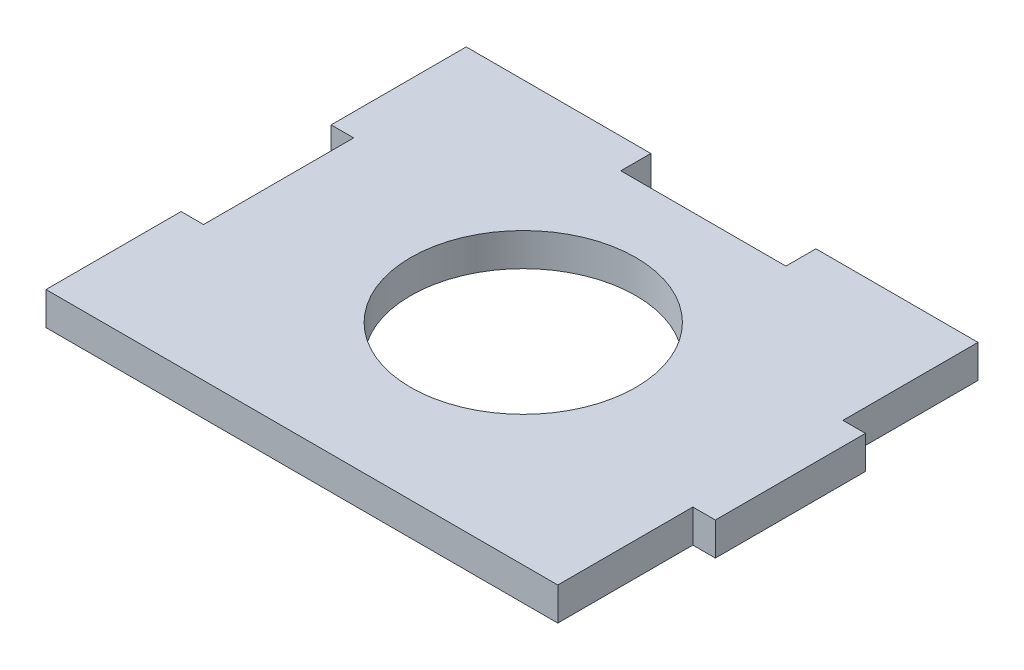
ISO-10303-21;
HEADER;
FILE_DESCRIPTION(('STEP AP214'),'2;1');
FILE_NAME('part.step','',(''),(''),'','','');
FILE_SCHEMA(('AUTOMOTIVE_DESIGN { 1 0 10303 214 1 1 1 1 }'));
ENDSEC;
DATA;
#1=APPLICATION_CONTEXT('core data for automotive mechanical design processes');
#2=APPLICATION_PROTOCOL_DEFINITION('international standard','automotive_design',2000,#1);
#3=PRODUCT_CONTEXT('',#1,'mechanical');
#4=PRODUCT('Part','Part','',(#3));
#5=PRODUCT_RELATED_PRODUCT_CATEGORY('part','',(#4));
#6=PRODUCT_DEFINITION_FORMATION('','',#4);
#7=PRODUCT_DEFINITION_CONTEXT('part definition',#1,'design');
#8=PRODUCT_DEFINITION('design','',#6,#7);
#9=PRODUCT_DEFINITION_SHAPE('','',#8);
#10=(LENGTH_UNIT() NAMED_UNIT(*) SI_UNIT(.MILLI.,.METRE.));
#11=(NAMED_UNIT(*) PLANE_ANGLE_UNIT() SI_UNIT($,.RADIAN.));
#12=(NAMED_UNIT(*) SI_UNIT($,.STERADIAN.) SOLID_ANGLE_UNIT());
#13=UNCERTAINTY_MEASURE_WITH_UNIT(LENGTH_MEASURE(1.E-05),#10,'distance_accuracy_value','');
#14=(GEOMETRIC_REPRESENTATION_CONTEXT(3) GLOBAL_UNCERTAINTY_ASSIGNED_CONTEXT((#13)) GLOBAL_UNIT_ASSIGNED_CONTEXT((#10,
#11,#12)) REPRESENTATION_CONTEXT('',''));
#15=CARTESIAN_POINT('',(0.,0.,0.));
#16=DIRECTION('',(0.,0.,1.));
#17=DIRECTION('',(1.,0.,0.));
#18=AXIS2_PLACEMENT_3D('',#15,#16,#17);
#19=CARTESIAN_POINT('',(0.,2.2,-129.705799117017));
#20=DIRECTION('',(0.,0.,-1.));
#21=DIRECTION('',(-1.,0.,0.));
#22=AXIS2_PLACEMENT_3D('',#19,#20,#21);
#23=PLANE('',#22);
#24=DIRECTION('',(1.,0.,0.));
#25=VECTOR('',#24,1.);
#26=CARTESIAN_POINT('',(0.,0.,-129.705799117017));
#27=LINE('',#26,#25);
#28=CARTESIAN_POINT('',(-85.3045745686668,0.,-129.705799117017));
#29=VERTEX_POINT('',#28);
#30=CARTESIAN_POINT('',(-74.5045745686669,0.,-129.705799117017));
#31=VERTEX_POINT('',#30);
#32=EDGE_CURVE('E183',#29,#31,#27,.T.);
#33=ORIENTED_EDGE('',*,*,#32,.F.);
#34=DIRECTION('',(0.,-1.,0.));
#35=VECTOR('',#34,1.);
#36=CARTESIAN_POINT('',(-85.3045745686668,2.2,-129.705799117017));
#37=LINE('',#36,#35);
#38=CARTESIAN_POINT('',(-85.3045745686668,2.2,-129.705799117017));
#39=VERTEX_POINT('',#38);
#40=EDGE_CURVE('E11',#39,#29,#37,.T.);
#41=ORIENTED_EDGE('',*,*,#40,.F.);
#42=DIRECTION('',(1.,0.,0.));
#43=VECTOR('',#42,1.);
#44=CARTESIAN_POINT('',(0.,2.2,-129.705799117017));
#45=LINE('',#44,#43);
#46=CARTESIAN_POINT('',(-74.5045745686669,2.2,-129.705799117017));
#47=VERTEX_POINT('',#46);
#48=EDGE_CURVE('E281',#39,#47,#45,.T.);
#49=ORIENTED_EDGE('',*,*,#48,.T.);
#50=DIRECTION('',(0.,-1.,0.));
#51=VECTOR('',#50,1.);
#52=CARTESIAN_POINT('',(-74.5045745686669,2.2,-129.705799117017));
#53=LINE('',#52,#51);
#54=EDGE_CURVE('E54',#47,#31,#53,.T.);
#55=ORIENTED_EDGE('',*,*,#54,.T.);
#56=EDGE_LOOP('',(#33,#41,#49,#55));
#57=FACE_BOUND('',#56,.T.);
#58=ADVANCED_FACE('F37',(#57),#23,.T.);
#59=CARTESIAN_POINT('',(-85.3045745686704,2.2,-2.36767756979978E-12));
#60=DIRECTION('',(1.,0.,0.));
#61=DIRECTION('',(0.,0.,-1.));
#62=AXIS2_PLACEMENT_3D('',#59,#60,#61);
#63=PLANE('',#62);
#64=DIRECTION('',(0.,0.,1.));
#65=VECTOR('',#64,1.);
#66=CARTESIAN_POINT('',(-85.3045745686704,0.,-2.36767756979978E-12));
#67=LINE('',#66,#65);
#68=CARTESIAN_POINT('',(-85.3045745686668,0.,-127.705799117017));
#69=VERTEX_POINT('',#68);
#70=EDGE_CURVE('E185',#29,#69,#67,.T.);
#71=ORIENTED_EDGE('',*,*,#70,.T.);
#72=DIRECTION('',(0.,-1.,0.));
#73=VECTOR('',#72,1.);
#74=CARTESIAN_POINT('',(-85.3045745686668,2.2,-127.705799117017));
#75=LINE('',#74,#73);
#76=CARTESIAN_POINT('',(-85.3045745686668,2.2,-127.705799117017));
#77=VERTEX_POINT('',#76);
#78=EDGE_CURVE('E46',#77,#69,#75,.T.);
#79=ORIENTED_EDGE('',*,*,#78,.F.);
#80=DIRECTION('',(0.,0.,1.));
#81=VECTOR('',#80,1.);
#82=CARTESIAN_POINT('',(-85.3045745686704,2.2,-2.36767756979978E-12));
#83=LINE('',#82,#81);
#84=EDGE_CURVE('E277',#39,#77,#83,.T.);
#85=ORIENTED_EDGE('',*,*,#84,.F.);
#86=ORIENTED_EDGE('',*,*,#40,.T.);
#87=EDGE_LOOP('',(#71,#79,#85,#86));
#88=FACE_BOUND('',#87,.T.);
#89=ADVANCED_FACE('F264',(#88),#63,.F.);
#90=CARTESIAN_POINT('',(0.,2.2,-127.705799117017));
#91=DIRECTION('',(0.,0.,-1.));
#92=DIRECTION('',(-1.,0.,0.));
#93=AXIS2_PLACEMENT_3D('',#90,#91,#92);
#94=PLANE('',#93);
#95=DIRECTION('',(1.,0.,0.));
#96=VECTOR('',#95,1.);
#97=CARTESIAN_POINT('',(0.,0.,-127.705799117017));
#98=LINE('',#97,#96);
#99=CARTESIAN_POINT('',(-96.3045745686668,0.,-127.705799117017));
#100=VERTEX_POINT('',#99);
#101=EDGE_CURVE('E188',#100,#69,#98,.T.);
#102=ORIENTED_EDGE('',*,*,#101,.F.);
#103=DIRECTION('',(0.,-1.,0.));
#104=VECTOR('',#103,1.);
#105=CARTESIAN_POINT('',(-96.3045745686668,2.2,-127.705799117017));
#106=LINE('',#105,#104);
#107=CARTESIAN_POINT('',(-96.3045745686668,2.2,-127.705799117017));
#108=VERTEX_POINT('',#107);
#109=EDGE_CURVE('E254',#108,#100,#106,.T.);
#110=ORIENTED_EDGE('',*,*,#109,.F.);
#111=DIRECTION('',(1.,0.,0.));
#112=VECTOR('',#111,1.);
#113=CARTESIAN_POINT('',(0.,2.2,-127.705799117017));
#114=LINE('',#113,#112);
#115=EDGE_CURVE('E261',#108,#77,#114,.T.);
#116=ORIENTED_EDGE('',*,*,#115,.T.);
#117=ORIENTED_EDGE('',*,*,#78,.T.);
#118=EDGE_LOOP('',(#102,#110,#116,#117));
#119=FACE_BOUND('',#118,.T.);
#120=ADVANCED_FACE('F259',(#119),#94,.T.);
#121=CARTESIAN_POINT('',(-96.3045745686632,2.2,2.6729889015715E-12));
#122=DIRECTION('',(1.,0.,0.));
#123=DIRECTION('',(0.,0.,-1.));
#124=AXIS2_PLACEMENT_3D('',#121,#122,#123);
#125=PLANE('',#124);
#126=DIRECTION('',(0.,0.,1.));
#127=VECTOR('',#126,1.);
#128=CARTESIAN_POINT('',(-96.3045745686632,0.,2.6729889015715E-12));
#129=LINE('',#128,#127);
#130=CARTESIAN_POINT('',(-96.3045745686668,0.,-129.705799117017));
#131=VERTEX_POINT('',#130);
#132=EDGE_CURVE('E191',#131,#100,#129,.T.);
#133=ORIENTED_EDGE('',*,*,#132,.F.);
#134=DIRECTION('',(0.,-1.,0.));
#135=VECTOR('',#134,1.);
#136=CARTESIAN_POINT('',(-96.3045745686668,2.2,-129.705799117017));
#137=LINE('',#136,#135);
#138=CARTESIAN_POINT('',(-96.3045745686668,2.2,-129.705799117017));
#139=VERTEX_POINT('',#138);
#140=EDGE_CURVE('E252',#139,#131,#137,.T.);
#141=ORIENTED_EDGE('',*,*,#140,.F.);
#142=DIRECTION('',(0.,0.,1.));
#143=VECTOR('',#142,1.);
#144=CARTESIAN_POINT('',(-96.3045745686632,2.2,2.6729889015715E-12));
#145=LINE('',#144,#143);
#146=EDGE_CURVE('E274',#139,#108,#145,.T.);
#147=ORIENTED_EDGE('',*,*,#146,.T.);
#148=ORIENTED_EDGE('',*,*,#109,.T.);
#149=EDGE_LOOP('',(#133,#141,#147,#148));
#150=FACE_BOUND('',#149,.T.);
#151=ADVANCED_FACE('F271',(#150),#125,.T.);
#152=CARTESIAN_POINT('',(0.,2.2,-129.705799117017));
#153=DIRECTION('',(0.,0.,-1.));
#154=DIRECTION('',(-1.,0.,0.));
#155=AXIS2_PLACEMENT_3D('',#152,#153,#154);
#156=PLANE('',#155);
#157=DIRECTION('',(1.,0.,0.));
#158=VECTOR('',#157,1.);
#159=CARTESIAN_POINT('',(0.,0.,-129.705799117017));
#160=LINE('',#159,#158);
#161=CARTESIAN_POINT('',(-108.604574568667,0.,-129.705799117017));
#162=VERTEX_POINT('',#161);
#163=EDGE_CURVE('E194',#162,#131,#160,.T.);
#164=ORIENTED_EDGE('',*,*,#163,.F.);
#165=DIRECTION('',(0.,-1.,0.));
#166=VECTOR('',#165,1.);
#167=CARTESIAN_POINT('',(-108.604574568667,2.2,-129.705799117017));
#168=LINE('',#167,#166);
#169=CARTESIAN_POINT('',(-108.604574568667,2.2,-129.705799117017));
#170=VERTEX_POINT('',#169);
#171=EDGE_CURVE('E250',#170,#162,#168,.T.);
#172=ORIENTED_EDGE('',*,*,#171,.F.);
#173=DIRECTION('',(1.,0.,0.));
#174=VECTOR('',#173,1.);
#175=CARTESIAN_POINT('',(0.,2.2,-129.705799117017));
#176=LINE('',#175,#174);
#177=EDGE_CURVE('E279',#170,#139,#176,.T.);
#178=ORIENTED_EDGE('',*,*,#177,.T.);
#179=ORIENTED_EDGE('',*,*,#140,.T.);
#180=EDGE_LOOP('',(#164,#172,#178,#179));
#181=FACE_BOUND('',#180,.T.);
#182=ADVANCED_FACE('F331',(#181),#156,.T.);
#183=CARTESIAN_POINT('',(-108.604574568667,2.2,0.));
#184=DIRECTION('',(1.,0.,0.));
#185=DIRECTION('',(0.,0.,-1.));
#186=AXIS2_PLACEMENT_3D('',#183,#184,#185);
#187=PLANE('',#186);
#188=DIRECTION('',(0.,0.,1.));
#189=VECTOR('',#188,1.);
#190=CARTESIAN_POINT('',(-108.604574568667,0.,0.));
#191=LINE('',#190,#189);
#192=CARTESIAN_POINT('',(-108.604574568667,0.,-120.705799117017));
#193=VERTEX_POINT('',#192);
#194=EDGE_CURVE('E197',#162,#193,#191,.T.);
#195=ORIENTED_EDGE('',*,*,#194,.T.);
#196=DIRECTION('',(0.,-1.,0.));
#197=VECTOR('',#196,1.);
#198=CARTESIAN_POINT('',(-108.604574568667,2.2,-120.705799117017));
#199=LINE('',#198,#197);
#200=CARTESIAN_POINT('',(-108.604574568667,2.2,-120.705799117017));
#201=VERTEX_POINT('',#200);
#202=EDGE_CURVE('E247',#201,#193,#199,.T.);
#203=ORIENTED_EDGE('',*,*,#202,.F.);
#204=DIRECTION('',(0.,0.,1.));
#205=VECTOR('',#204,1.);
#206=CARTESIAN_POINT('',(-108.604574568667,2.2,0.));
#207=LINE('',#206,#205);
#208=EDGE_CURVE('E286',#170,#201,#207,.T.);
#209=ORIENTED_EDGE('',*,*,#208,.F.);
#210=ORIENTED_EDGE('',*,*,#171,.T.);
#211=EDGE_LOOP('',(#195,#203,#209,#210));
#212=FACE_BOUND('',#211,.T.);
#213=ADVANCED_FACE('F334',(#212),#187,.F.);
#214=CARTESIAN_POINT('',(0.,2.2,-120.705799117017));
#215=DIRECTION('',(0.,0.,-1.));
#216=DIRECTION('',(-1.,0.,0.));
#217=AXIS2_PLACEMENT_3D('',#214,#215,#216);
#218=PLANE('',#217);
#219=DIRECTION('',(1.,0.,0.));
#220=VECTOR('',#219,1.);
#221=CARTESIAN_POINT('',(0.,0.,-120.705799117017));
#222=LINE('',#221,#220);
#223=CARTESIAN_POINT('',(-107.104574568667,0.,-120.705799117017));
#224=VERTEX_POINT('',#223);
#225=EDGE_CURVE('E200',#193,#224,#222,.T.);
#226=ORIENTED_EDGE('',*,*,#225,.T.);
#227=DIRECTION('',(0.,-1.,0.));
#228=VECTOR('',#227,1.);
#229=CARTESIAN_POINT('',(-107.104574568667,2.2,-120.705799117017));
#230=LINE('',#229,#228);
#231=CARTESIAN_POINT('',(-107.104574568667,2.2,-120.705799117017));
#232=VERTEX_POINT('',#231);
#233=EDGE_CURVE('E244',#232,#224,#230,.T.);
#234=ORIENTED_EDGE('',*,*,#233,.F.);
#235=DIRECTION('',(1.,0.,0.));
#236=VECTOR('',#235,1.);
#237=CARTESIAN_POINT('',(0.,2.2,-120.705799117017));
#238=LINE('',#237,#236);
#239=EDGE_CURVE('E289',#201,#232,#238,.T.);
#240=ORIENTED_EDGE('',*,*,#239,.F.);
#241=ORIENTED_EDGE('',*,*,#202,.T.);
#242=EDGE_LOOP('',(#226,#234,#240,#241));
#243=FACE_BOUND('',#242,.T.);
#244=ADVANCED_FACE('F338',(#243),#218,.F.);
#245=CARTESIAN_POINT('',(-107.104574568667,2.2,0.));
#246=DIRECTION('',(1.,0.,0.));
#247=DIRECTION('',(0.,0.,-1.));
#248=AXIS2_PLACEMENT_3D('',#245,#246,#247);
#249=PLANE('',#248);
#250=DIRECTION('',(0.,0.,1.));
#251=VECTOR('',#250,1.);
#252=CARTESIAN_POINT('',(-107.104574568667,0.,0.));
#253=LINE('',#252,#251);
#254=CARTESIAN_POINT('',(-107.104574568667,0.,-110.705799117018));
#255=VERTEX_POINT('',#254);
#256=EDGE_CURVE('E203',#224,#255,#253,.T.);
#257=ORIENTED_EDGE('',*,*,#256,.T.);
#258=DIRECTION('',(0.,-1.,0.));
#259=VECTOR('',#258,1.);
#260=CARTESIAN_POINT('',(-107.104574568667,2.2,-110.705799117018));
#261=LINE('',#260,#259);
#262=CARTESIAN_POINT('',(-107.104574568667,2.2,-110.705799117018));
#263=VERTEX_POINT('',#262);
#264=EDGE_CURVE('E241',#263,#255,#261,.T.);
#265=ORIENTED_EDGE('',*,*,#264,.F.);
#266=DIRECTION('',(0.,0.,1.));
#267=VECTOR('',#266,1.);
#268=CARTESIAN_POINT('',(-107.104574568667,2.2,0.));
#269=LINE('',#268,#267);
#270=EDGE_CURVE('E292',#232,#263,#269,.T.);
#271=ORIENTED_EDGE('',*,*,#270,.F.);
#272=ORIENTED_EDGE('',*,*,#233,.T.);
#273=EDGE_LOOP('',(#257,#265,#271,#272));
#274=FACE_BOUND('',#273,.T.);
#275=ADVANCED_FACE('F342',(#274),#249,.F.);
#276=CARTESIAN_POINT('',(0.,2.2,-110.705799117018));
#277=DIRECTION('',(0.,0.,1.));
#278=DIRECTION('',(1.,0.,0.));
#279=AXIS2_PLACEMENT_3D('',#276,#277,#278);
#280=PLANE('',#279);
#281=DIRECTION('',(-1.,0.,0.));
#282=VECTOR('',#281,1.);
#283=CARTESIAN_POINT('',(0.,0.,-110.705799117018));
#284=LINE('',#283,#282);
#285=CARTESIAN_POINT('',(-108.604574568667,0.,-110.705799117018));
#286=VERTEX_POINT('',#285);
#287=EDGE_CURVE('E206',#255,#286,#284,.T.);
#288=ORIENTED_EDGE('',*,*,#287,.T.);
#289=DIRECTION('',(0.,-1.,0.));
#290=VECTOR('',#289,1.);
#291=CARTESIAN_POINT('',(-108.604574568667,2.2,-110.705799117018));
#292=LINE('',#291,#290);
#293=CARTESIAN_POINT('',(-108.604574568667,2.2,-110.705799117018));
#294=VERTEX_POINT('',#293);
#295=EDGE_CURVE('E238',#294,#286,#292,.T.);
#296=ORIENTED_EDGE('',*,*,#295,.F.);
#297=DIRECTION('',(-1.,0.,0.));
#298=VECTOR('',#297,1.);
#299=CARTESIAN_POINT('',(0.,2.2,-110.705799117018));
#300=LINE('',#299,#298);
#301=EDGE_CURVE('E295',#263,#294,#300,.T.);
#302=ORIENTED_EDGE('',*,*,#301,.F.);
#303=ORIENTED_EDGE('',*,*,#264,.T.);
#304=EDGE_LOOP('',(#288,#296,#302,#303));
#305=FACE_BOUND('',#304,.T.);
#306=ADVANCED_FACE('F346',(#305),#280,.F.);
#307=CARTESIAN_POINT('',(-108.604574568667,2.2,0.));
#308=DIRECTION('',(1.,0.,0.));
#309=DIRECTION('',(0.,0.,-1.));
#310=AXIS2_PLACEMENT_3D('',#307,#308,#309);
#311=PLANE('',#310);
#312=DIRECTION('',(0.,0.,1.));
#313=VECTOR('',#312,1.);
#314=CARTESIAN_POINT('',(-108.604574568667,0.,0.));
#315=LINE('',#314,#313);
#316=CARTESIAN_POINT('',(-108.604574568667,0.,-101.705799117017));
#317=VERTEX_POINT('',#316);
#318=EDGE_CURVE('E209',#286,#317,#315,.T.);
#319=ORIENTED_EDGE('',*,*,#318,.T.);
#320=DIRECTION('',(0.,-1.,0.));
#321=VECTOR('',#320,1.);
#322=CARTESIAN_POINT('',(-108.604574568667,2.2,-101.705799117017));
#323=LINE('',#322,#321);
#324=CARTESIAN_POINT('',(-108.604574568667,2.2,-101.705799117017));
#325=VERTEX_POINT('',#324);
#326=EDGE_CURVE('E235',#325,#317,#323,.T.);
#327=ORIENTED_EDGE('',*,*,#326,.F.);
#328=DIRECTION('',(0.,0.,1.));
#329=VECTOR('',#328,1.);
#330=CARTESIAN_POINT('',(-108.604574568667,2.2,0.));
#331=LINE('',#330,#329);
#332=EDGE_CURVE('E298',#294,#325,#331,.T.);
#333=ORIENTED_EDGE('',*,*,#332,.F.);
#334=ORIENTED_EDGE('',*,*,#295,.T.);
#335=EDGE_LOOP('',(#319,#327,#333,#334));
#336=FACE_BOUND('',#335,.T.);
#337=ADVANCED_FACE('F350',(#336),#311,.F.);
#338=CARTESIAN_POINT('',(0.,2.2,-101.705799117017));
#339=DIRECTION('',(0.,0.,-1.));
#340=DIRECTION('',(-1.,0.,0.));
#341=AXIS2_PLACEMENT_3D('',#338,#339,#340);
#342=PLANE('',#341);
#343=DIRECTION('',(1.,0.,0.));
#344=VECTOR('',#343,1.);
#345=CARTESIAN_POINT('',(0.,0.,-101.705799117017));
#346=LINE('',#345,#344);
#347=CARTESIAN_POINT('',(-74.5045745686669,0.,-101.705799117017));
#348=VERTEX_POINT('',#347);
#349=EDGE_CURVE('E212',#317,#348,#346,.T.);
#350=ORIENTED_EDGE('',*,*,#349,.T.);
#351=DIRECTION('',(0.,-1.,0.));
#352=VECTOR('',#351,1.);
#353=CARTESIAN_POINT('',(-74.5045745686669,2.2,-101.705799117017));
#354=LINE('',#353,#352);
#355=CARTESIAN_POINT('',(-74.5045745686669,2.2,-101.705799117017));
#356=VERTEX_POINT('',#355);
#357=EDGE_CURVE('E233',#356,#348,#354,.T.);
#358=ORIENTED_EDGE('',*,*,#357,.F.);
#359=DIRECTION('',(1.,0.,0.));
#360=VECTOR('',#359,1.);
#361=CARTESIAN_POINT('',(0.,2.2,-101.705799117017));
#362=LINE('',#361,#360);
#363=EDGE_CURVE('E301',#325,#356,#362,.T.);
#364=ORIENTED_EDGE('',*,*,#363,.F.);
#365=ORIENTED_EDGE('',*,*,#326,.T.);
#366=EDGE_LOOP('',(#350,#358,#364,#365));
#367=FACE_BOUND('',#366,.T.);
#368=ADVANCED_FACE('F354',(#367),#342,.F.);
#369=CARTESIAN_POINT('',(-74.5045745686669,2.2,0.));
#370=DIRECTION('',(1.,0.,0.));
#371=DIRECTION('',(0.,0.,-1.));
#372=AXIS2_PLACEMENT_3D('',#369,#370,#371);
#373=PLANE('',#372);
#374=DIRECTION('',(0.,0.,1.));
#375=VECTOR('',#374,1.);
#376=CARTESIAN_POINT('',(-74.5045745686669,0.,0.));
#377=LINE('',#376,#375);
#378=CARTESIAN_POINT('',(-74.5045745686669,0.,-110.705799117017));
#379=VERTEX_POINT('',#378);
#380=EDGE_CURVE('E215',#379,#348,#377,.T.);
#381=ORIENTED_EDGE('',*,*,#380,.F.);
#382=DIRECTION('',(0.,-1.,0.));
#383=VECTOR('',#382,1.);
#384=CARTESIAN_POINT('',(-74.5045745686669,2.2,-110.705799117017));
#385=LINE('',#384,#383);
#386=CARTESIAN_POINT('',(-74.5045745686669,2.2,-110.705799117017));
#387=VERTEX_POINT('',#386);
#388=EDGE_CURVE('E231',#387,#379,#385,.T.);
#389=ORIENTED_EDGE('',*,*,#388,.F.);
#390=DIRECTION('',(0.,0.,1.));
#391=VECTOR('',#390,1.);
#392=CARTESIAN_POINT('',(-74.5045745686669,2.2,0.));
#393=LINE('',#392,#391);
#394=EDGE_CURVE('E303',#387,#356,#393,.T.);
#395=ORIENTED_EDGE('',*,*,#394,.T.);
#396=ORIENTED_EDGE('',*,*,#357,.T.);
#397=EDGE_LOOP('',(#381,#389,#395,#396));
#398=FACE_BOUND('',#397,.T.);
#399=ADVANCED_FACE('F358',(#398),#373,.T.);
#400=CARTESIAN_POINT('',(0.,2.2,-110.705799117017));
#401=DIRECTION('',(0.,0.,1.));
#402=DIRECTION('',(1.,0.,0.));
#403=AXIS2_PLACEMENT_3D('',#400,#401,#402);
#404=PLANE('',#403);
#405=DIRECTION('',(-1.,0.,0.));
#406=VECTOR('',#405,1.);
#407=CARTESIAN_POINT('',(0.,0.,-110.705799117017));
#408=LINE('',#407,#406);
#409=CARTESIAN_POINT('',(-73.0045745686668,0.,-110.705799117017));
#410=VERTEX_POINT('',#409);
#411=EDGE_CURVE('E218',#410,#379,#408,.T.);
#412=ORIENTED_EDGE('',*,*,#411,.F.);
#413=DIRECTION('',(0.,-1.,0.));
#414=VECTOR('',#413,1.);
#415=CARTESIAN_POINT('',(-73.0045745686668,2.2,-110.705799117017));
#416=LINE('',#415,#414);
#417=CARTESIAN_POINT('',(-73.0045745686668,2.2,-110.705799117017));
#418=VERTEX_POINT('',#417);
#419=EDGE_CURVE('E161',#418,#410,#416,.T.);
#420=ORIENTED_EDGE('',*,*,#419,.F.);
#421=DIRECTION('',(-1.,0.,0.));
#422=VECTOR('',#421,1.);
#423=CARTESIAN_POINT('',(0.,2.2,-110.705799117017));
#424=LINE('',#423,#422);
#425=EDGE_CURVE('E172',#418,#387,#424,.T.);
#426=ORIENTED_EDGE('',*,*,#425,.T.);
#427=ORIENTED_EDGE('',*,*,#388,.T.);
#428=EDGE_LOOP('',(#412,#420,#426,#427));
#429=FACE_BOUND('',#428,.T.);
#430=ADVANCED_FACE('F307',(#429),#404,.T.);
#431=CARTESIAN_POINT('',(-73.0045745686668,2.2,0.));
#432=DIRECTION('',(1.,0.,0.));
#433=DIRECTION('',(0.,0.,-1.));
#434=AXIS2_PLACEMENT_3D('',#431,#432,#433);
#435=PLANE('',#434);
#436=DIRECTION('',(0.,0.,1.));
#437=VECTOR('',#436,1.);
#438=CARTESIAN_POINT('',(-73.0045745686668,0.,0.));
#439=LINE('',#438,#437);
#440=CARTESIAN_POINT('',(-73.0045745686668,0.,-120.705799117017));
#441=VERTEX_POINT('',#440);
#442=EDGE_CURVE('E157',#441,#410,#439,.T.);
#443=ORIENTED_EDGE('',*,*,#442,.F.);
#444=DIRECTION('',(0.,-1.,0.));
#445=VECTOR('',#444,1.);
#446=CARTESIAN_POINT('',(-73.0045745686668,2.2,-120.705799117017));
#447=LINE('',#446,#445);
#448=CARTESIAN_POINT('',(-73.0045745686668,2.2,-120.705799117017));
#449=VERTEX_POINT('',#448);
#450=EDGE_CURVE('E152',#449,#441,#447,.T.);
#451=ORIENTED_EDGE('',*,*,#450,.F.);
#452=DIRECTION('',(0.,0.,1.));
#453=VECTOR('',#452,1.);
#454=CARTESIAN_POINT('',(-73.0045745686668,2.2,0.));
#455=LINE('',#454,#453);
#456=EDGE_CURVE('E155',#449,#418,#455,.T.);
#457=ORIENTED_EDGE('',*,*,#456,.T.);
#458=ORIENTED_EDGE('',*,*,#419,.T.);
#459=EDGE_LOOP('',(#443,#451,#457,#458));
#460=FACE_BOUND('',#459,.T.);
#461=ADVANCED_FACE('F154',(#460),#435,.T.);
#462=CARTESIAN_POINT('',(0.,2.2,-120.705799117017));
#463=DIRECTION('',(0.,0.,-1.));
#464=DIRECTION('',(-1.,0.,0.));
#465=AXIS2_PLACEMENT_3D('',#462,#463,#464);
#466=PLANE('',#465);
#467=DIRECTION('',(1.,0.,0.));
#468=VECTOR('',#467,1.);
#469=CARTESIAN_POINT('',(0.,0.,-120.705799117017));
#470=LINE('',#469,#468);
#471=CARTESIAN_POINT('',(-74.5045745686669,0.,-120.705799117017));
#472=VERTEX_POINT('',#471);
#473=EDGE_CURVE('E222',#472,#441,#470,.T.);
#474=ORIENTED_EDGE('',*,*,#473,.F.);
#475=DIRECTION('',(0.,-1.,0.));
#476=VECTOR('',#475,1.);
#477=CARTESIAN_POINT('',(-74.5045745686669,2.2,-120.705799117017));
#478=LINE('',#477,#476);
#479=CARTESIAN_POINT('',(-74.5045745686669,2.2,-120.705799117017));
#480=VERTEX_POINT('',#479);
#481=EDGE_CURVE('E103',#480,#472,#478,.T.);
#482=ORIENTED_EDGE('',*,*,#481,.F.);
#483=DIRECTION('',(1.,0.,0.));
#484=VECTOR('',#483,1.);
#485=CARTESIAN_POINT('',(0.,2.2,-120.705799117017));
#486=LINE('',#485,#484);
#487=EDGE_CURVE('E169',#480,#449,#486,.T.);
#488=ORIENTED_EDGE('',*,*,#487,.T.);
#489=ORIENTED_EDGE('',*,*,#450,.T.);
#490=EDGE_LOOP('',(#474,#482,#488,#489));
#491=FACE_BOUND('',#490,.T.);
#492=ADVANCED_FACE('F174',(#491),#466,.T.);
#493=CARTESIAN_POINT('',(-90.8045745686668,2.2,-115.705799117017));
#494=DIRECTION('',(0.,-1.,0.));
#495=DIRECTION('',(0.,0.,-1.));
#496=AXIS2_PLACEMENT_3D('',#493,#494,#495);
#497=CYLINDRICAL_SURFACE('',#496,7.50000000000007);
#498=CARTESIAN_POINT('',(-90.8045745686668,2.2,-115.705799117017));
#499=DIRECTION('',(0.,1.,0.));
#500=DIRECTION('',(0.,0.,1.));
#501=AXIS2_PLACEMENT_3D('',#498,#499,#500);
#502=CIRCLE('',#501,7.50000000000007);
#503=CARTESIAN_POINT('',(-90.8045745686668,2.2,-108.205799117017));
#504=VERTEX_POINT('',#503);
#505=EDGE_CURVE('E227',#504,#504,#502,.T.);
#506=ORIENTED_EDGE('',*,*,#505,.T.);
#507=EDGE_LOOP('',(#506));
#508=FACE_BOUND('',#507,.T.);
#509=CARTESIAN_POINT('',(-90.8045745686668,0.,-115.705799117017));
#510=DIRECTION('',(0.,1.,0.));
#511=DIRECTION('',(0.,0.,1.));
#512=AXIS2_PLACEMENT_3D('',#509,#510,#511);
#513=CIRCLE('',#512,7.50000000000007);
#514=CARTESIAN_POINT('',(-90.8045745686668,0.,-108.205799117017));
#515=VERTEX_POINT('',#514);
#516=EDGE_CURVE('E180',#515,#515,#513,.T.);
#517=ORIENTED_EDGE('',*,*,#516,.F.);
#518=EDGE_LOOP('',(#517));
#519=FACE_BOUND('',#518,.T.);
#520=ADVANCED_FACE('F39',(#508,#519),#497,.F.);
#521=CARTESIAN_POINT('',(-74.5045745686669,2.2,0.));
#522=DIRECTION('',(1.,0.,0.));
#523=DIRECTION('',(0.,0.,-1.));
#524=AXIS2_PLACEMENT_3D('',#521,#522,#523);
#525=PLANE('',#524);
#526=DIRECTION('',(0.,0.,1.));
#527=VECTOR('',#526,1.);
#528=CARTESIAN_POINT('',(-74.5045745686669,0.,0.));
#529=LINE('',#528,#527);
#530=EDGE_CURVE('E224',#31,#472,#529,.T.);
#531=ORIENTED_EDGE('',*,*,#530,.F.);
#532=ORIENTED_EDGE('',*,*,#54,.F.);
#533=DIRECTION('',(0.,0.,1.));
#534=VECTOR('',#533,1.);
#535=CARTESIAN_POINT('',(-74.5045745686669,2.2,0.));
#536=LINE('',#535,#534);
#537=EDGE_CURVE('E175',#47,#480,#536,.T.);
#538=ORIENTED_EDGE('',*,*,#537,.T.);
#539=ORIENTED_EDGE('',*,*,#481,.T.);
#540=EDGE_LOOP('',(#531,#532,#538,#539));
#541=FACE_BOUND('',#540,.T.);
#542=ADVANCED_FACE('F309',(#541),#525,.T.);
#543=CARTESIAN_POINT('',(0.,2.2,0.));
#544=DIRECTION('',(0.,1.,0.));
#545=DIRECTION('',(0.,0.,1.));
#546=AXIS2_PLACEMENT_3D('',#543,#544,#545);
#547=PLANE('',#546);
#548=ORIENTED_EDGE('',*,*,#505,.F.);
#549=EDGE_LOOP('',(#548));
#550=FACE_BOUND('',#549,.T.);
#551=ORIENTED_EDGE('',*,*,#48,.F.);
#552=ORIENTED_EDGE('',*,*,#84,.T.);
#553=ORIENTED_EDGE('',*,*,#115,.F.);
#554=ORIENTED_EDGE('',*,*,#146,.F.);
#555=ORIENTED_EDGE('',*,*,#177,.F.);
#556=ORIENTED_EDGE('',*,*,#208,.T.);
#557=ORIENTED_EDGE('',*,*,#239,.T.);
#558=ORIENTED_EDGE('',*,*,#270,.T.);
#559=ORIENTED_EDGE('',*,*,#301,.T.);
#560=ORIENTED_EDGE('',*,*,#332,.T.);
#561=ORIENTED_EDGE('',*,*,#363,.T.);
#562=ORIENTED_EDGE('',*,*,#394,.F.);
#563=ORIENTED_EDGE('',*,*,#425,.F.);
#564=ORIENTED_EDGE('',*,*,#456,.F.);
#565=ORIENTED_EDGE('',*,*,#487,.F.);
#566=ORIENTED_EDGE('',*,*,#537,.F.);
#567=EDGE_LOOP('',(#551,#552,#553,#554,#555,#556,#557,#558,#559,#560,#561,#562,#563,#564,#565,#566));
#568=FACE_BOUND('',#567,.T.);
#569=ADVANCED_FACE('F167',(#550,#568),#547,.T.);
#570=CARTESIAN_POINT('',(0.,0.,0.));
#571=DIRECTION('',(0.,1.,0.));
#572=DIRECTION('',(0.,0.,1.));
#573=AXIS2_PLACEMENT_3D('',#570,#571,#572);
#574=PLANE('',#573);
#575=ORIENTED_EDGE('',*,*,#516,.T.);
#576=EDGE_LOOP('',(#575));
#577=FACE_BOUND('',#576,.T.);
#578=ORIENTED_EDGE('',*,*,#32,.T.);
#579=ORIENTED_EDGE('',*,*,#530,.T.);
#580=ORIENTED_EDGE('',*,*,#473,.T.);
#581=ORIENTED_EDGE('',*,*,#442,.T.);
#582=ORIENTED_EDGE('',*,*,#411,.T.);
#583=ORIENTED_EDGE('',*,*,#380,.T.);
#584=ORIENTED_EDGE('',*,*,#349,.F.);
#585=ORIENTED_EDGE('',*,*,#318,.F.);
#586=ORIENTED_EDGE('',*,*,#287,.F.);
#587=ORIENTED_EDGE('',*,*,#256,.F.);
#588=ORIENTED_EDGE('',*,*,#225,.F.);
#589=ORIENTED_EDGE('',*,*,#194,.F.);
#590=ORIENTED_EDGE('',*,*,#163,.T.);
#591=ORIENTED_EDGE('',*,*,#132,.T.);
#592=ORIENTED_EDGE('',*,*,#101,.T.);
#593=ORIENTED_EDGE('',*,*,#70,.F.);
#594=EDGE_LOOP('',(#578,#579,#580,#581,#582,#583,#584,#585,#586,#587,#588,#589,#590,#591,#592,#593));
#595=FACE_BOUND('',#594,.T.);
#596=ADVANCED_FACE('F266',(#577,#595),#574,.F.);
#597=CLOSED_SHELL('',(#58,#89,#120,#151,#182,#213,#244,#275,#306,#337,#368,#399,#430,#461,#492,
#520,#542,#569,#596));
#598=MANIFOLD_SOLID_BREP('B2',#597);
#599=ADVANCED_BREP_SHAPE_REPRESENTATION('',(#18,#598),#14);
#600=SHAPE_DEFINITION_REPRESENTATION(#9,#599);
ENDSEC;
END-ISO-10303-21;
